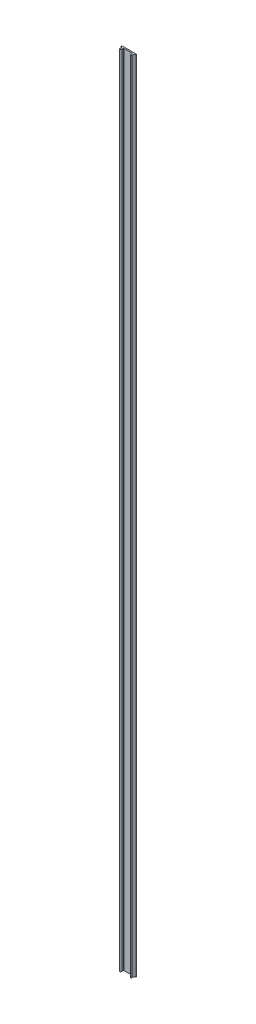
ISO-10303-21;
HEADER;
FILE_DESCRIPTION(('STEP AP214'),'2;1');
FILE_NAME('part.step','',(''),(''),'','','');
FILE_SCHEMA(('AUTOMOTIVE_DESIGN { 1 0 10303 214 1 1 1 1 }'));
ENDSEC;
DATA;
#1=APPLICATION_CONTEXT('core data for automotive mechanical design processes');
#2=APPLICATION_PROTOCOL_DEFINITION('international standard','automotive_design',2000,#1);
#3=PRODUCT_CONTEXT('',#1,'mechanical');
#4=PRODUCT('Part','Part','',(#3));
#5=PRODUCT_RELATED_PRODUCT_CATEGORY('part','',(#4));
#6=PRODUCT_DEFINITION_FORMATION('','',#4);
#7=PRODUCT_DEFINITION_CONTEXT('part definition',#1,'design');
#8=PRODUCT_DEFINITION('design','',#6,#7);
#9=PRODUCT_DEFINITION_SHAPE('','',#8);
#10=(LENGTH_UNIT() NAMED_UNIT(*) SI_UNIT(.MILLI.,.METRE.));
#11=(NAMED_UNIT(*) PLANE_ANGLE_UNIT() SI_UNIT($,.RADIAN.));
#12=(NAMED_UNIT(*) SI_UNIT($,.STERADIAN.) SOLID_ANGLE_UNIT());
#13=UNCERTAINTY_MEASURE_WITH_UNIT(LENGTH_MEASURE(1.E-05),#10,'distance_accuracy_value','');
#14=(GEOMETRIC_REPRESENTATION_CONTEXT(3) GLOBAL_UNCERTAINTY_ASSIGNED_CONTEXT((#13)) GLOBAL_UNIT_ASSIGNED_CONTEXT((#10,
#11,#12)) REPRESENTATION_CONTEXT('',''));
#15=CARTESIAN_POINT('',(0.,0.,0.));
#16=DIRECTION('',(0.,0.,1.));
#17=DIRECTION('',(1.,0.,0.));
#18=AXIS2_PLACEMENT_3D('',#15,#16,#17);
#19=CARTESIAN_POINT('',(4.23579334551751,500.,-0.3048));
#20=DIRECTION('',(0.,-1.,0.));
#21=DIRECTION('',(0.,0.,-1.));
#22=AXIS2_PLACEMENT_3D('',#19,#20,#21);
#23=CYLINDRICAL_SURFACE('',#22,0.457200000000001);
#24=CARTESIAN_POINT('',(4.23579334551751,0.,-0.3048));
#25=DIRECTION('',(0.,1.,0.));
#26=DIRECTION('',(0.,0.,1.));
#27=AXIS2_PLACEMENT_3D('',#24,#25,#26);
#28=CIRCLE('',#27,0.457200000000001);
#29=CARTESIAN_POINT('',(4.69299334551751,0.,-0.304799999999991));
#30=VERTEX_POINT('',#29);
#31=CARTESIAN_POINT('',(4.23579334551751,0.,-0.762));
#32=VERTEX_POINT('',#31);
#33=EDGE_CURVE('E123',#30,#32,#28,.T.);
#34=ORIENTED_EDGE('',*,*,#33,.T.);
#35=DIRECTION('',(0.,-1.,0.));
#36=VECTOR('',#35,1.);
#37=CARTESIAN_POINT('',(4.23579334551751,500.,-0.762));
#38=LINE('',#37,#36);
#39=CARTESIAN_POINT('',(4.23579334551751,500.,-0.762));
#40=VERTEX_POINT('',#39);
#41=EDGE_CURVE('E11',#40,#32,#38,.T.);
#42=ORIENTED_EDGE('',*,*,#41,.F.);
#43=CARTESIAN_POINT('',(4.23579334551751,500.,-0.3048));
#44=DIRECTION('',(0.,1.,0.));
#45=DIRECTION('',(0.,0.,1.));
#46=AXIS2_PLACEMENT_3D('',#43,#44,#45);
#47=CIRCLE('',#46,0.457200000000001);
#48=CARTESIAN_POINT('',(4.69299334551751,500.,-0.304799999999991));
#49=VERTEX_POINT('',#48);
#50=EDGE_CURVE('E137',#49,#40,#47,.T.);
#51=ORIENTED_EDGE('',*,*,#50,.F.);
#52=DIRECTION('',(0.,-1.,0.));
#53=VECTOR('',#52,1.);
#54=CARTESIAN_POINT('',(4.69299334551751,500.,-0.304799999999991));
#55=LINE('',#54,#53);
#56=EDGE_CURVE('E119',#49,#30,#55,.T.);
#57=ORIENTED_EDGE('',*,*,#56,.T.);
#58=EDGE_LOOP('',(#34,#42,#51,#57));
#59=FACE_BOUND('',#58,.T.);
#60=ADVANCED_FACE('F34',(#59),#23,.T.);
#61=CARTESIAN_POINT('',(0.,500.,-0.762));
#62=DIRECTION('',(0.,0.,1.));
#63=DIRECTION('',(1.,0.,0.));
#64=AXIS2_PLACEMENT_3D('',#61,#62,#63);
#65=PLANE('',#64);
#66=DIRECTION('',(-1.,0.,0.));
#67=VECTOR('',#66,1.);
#68=CARTESIAN_POINT('',(0.,0.,-0.762));
#69=LINE('',#68,#67);
#70=CARTESIAN_POINT('',(-4.23579334551751,0.,-0.762));
#71=VERTEX_POINT('',#70);
#72=EDGE_CURVE('E126',#32,#71,#69,.T.);
#73=ORIENTED_EDGE('',*,*,#72,.T.);
#74=DIRECTION('',(0.,-1.,0.));
#75=VECTOR('',#74,1.);
#76=CARTESIAN_POINT('',(-4.23579334551751,500.,-0.762));
#77=LINE('',#76,#75);
#78=CARTESIAN_POINT('',(-4.23579334551751,500.,-0.762));
#79=VERTEX_POINT('',#78);
#80=EDGE_CURVE('E298',#79,#71,#77,.T.);
#81=ORIENTED_EDGE('',*,*,#80,.F.);
#82=DIRECTION('',(-1.,0.,0.));
#83=VECTOR('',#82,1.);
#84=CARTESIAN_POINT('',(0.,500.,-0.762));
#85=LINE('',#84,#83);
#86=EDGE_CURVE('E88',#40,#79,#85,.T.);
#87=ORIENTED_EDGE('',*,*,#86,.F.);
#88=ORIENTED_EDGE('',*,*,#41,.T.);
#89=EDGE_LOOP('',(#73,#81,#87,#88));
#90=FACE_BOUND('',#89,.T.);
#91=ADVANCED_FACE('F169',(#90),#65,.F.);
#92=CARTESIAN_POINT('',(0.,500.,0.));
#93=DIRECTION('',(0.,0.,-1.));
#94=DIRECTION('',(-1.,0.,0.));
#95=AXIS2_PLACEMENT_3D('',#92,#93,#94);
#96=PLANE('',#95);
#97=DIRECTION('',(1.,0.,0.));
#98=VECTOR('',#97,1.);
#99=CARTESIAN_POINT('',(0.,0.,0.));
#100=LINE('',#99,#98);
#101=CARTESIAN_POINT('',(-2.43239334551752,0.,0.));
#102=VERTEX_POINT('',#101);
#103=CARTESIAN_POINT('',(2.43239334551752,0.,0.));
#104=VERTEX_POINT('',#103);
#105=EDGE_CURVE('E130',#102,#104,#100,.T.);
#106=ORIENTED_EDGE('',*,*,#105,.T.);
#107=DIRECTION('',(0.,-1.,0.));
#108=VECTOR('',#107,1.);
#109=CARTESIAN_POINT('',(2.43239334551752,500.,0.));
#110=LINE('',#109,#108);
#111=CARTESIAN_POINT('',(2.43239334551752,500.,0.));
#112=VERTEX_POINT('',#111);
#113=EDGE_CURVE('E42',#112,#104,#110,.T.);
#114=ORIENTED_EDGE('',*,*,#113,.F.);
#115=DIRECTION('',(1.,0.,0.));
#116=VECTOR('',#115,1.);
#117=CARTESIAN_POINT('',(0.,500.,0.));
#118=LINE('',#117,#116);
#119=CARTESIAN_POINT('',(-2.43239334551752,500.,0.));
#120=VERTEX_POINT('',#119);
#121=EDGE_CURVE('E314',#120,#112,#118,.T.);
#122=ORIENTED_EDGE('',*,*,#121,.F.);
#123=DIRECTION('',(0.,-1.,0.));
#124=VECTOR('',#123,1.);
#125=CARTESIAN_POINT('',(-2.43239334551752,500.,0.));
#126=LINE('',#125,#124);
#127=EDGE_CURVE('E281',#120,#102,#126,.T.);
#128=ORIENTED_EDGE('',*,*,#127,.T.);
#129=EDGE_LOOP('',(#106,#114,#122,#128));
#130=FACE_BOUND('',#129,.T.);
#131=ADVANCED_FACE('F173',(#130),#96,.F.);
#132=CARTESIAN_POINT('',(2.43239334551752,500.,0.457199999999991));
#133=DIRECTION('',(0.,-1.,0.));
#134=DIRECTION('',(0.,0.,-1.));
#135=AXIS2_PLACEMENT_3D('',#132,#133,#134);
#136=CYLINDRICAL_SURFACE('',#135,0.457199999999991);
#137=CARTESIAN_POINT('',(2.43239334551752,0.,0.457199999999991));
#138=DIRECTION('',(0.,-1.,0.));
#139=DIRECTION('',(0.,0.,1.));
#140=AXIS2_PLACEMENT_3D('',#137,#138,#139);
#141=CIRCLE('',#140,0.457199999999991);
#142=CARTESIAN_POINT('',(2.88959334551751,0.,0.457199999999991));
#143=VERTEX_POINT('',#142);
#144=EDGE_CURVE('E132',#104,#143,#141,.T.);
#145=ORIENTED_EDGE('',*,*,#144,.T.);
#146=DIRECTION('',(0.,-1.,0.));
#147=VECTOR('',#146,1.);
#148=CARTESIAN_POINT('',(2.88959334551751,500.,0.457199999999991));
#149=LINE('',#148,#147);
#150=CARTESIAN_POINT('',(2.88959334551751,500.,0.457199999999991));
#151=VERTEX_POINT('',#150);
#152=EDGE_CURVE('E114',#151,#143,#149,.T.);
#153=ORIENTED_EDGE('',*,*,#152,.F.);
#154=CARTESIAN_POINT('',(2.43239334551752,500.,0.457199999999991));
#155=DIRECTION('',(0.,-1.,0.));
#156=DIRECTION('',(0.,0.,1.));
#157=AXIS2_PLACEMENT_3D('',#154,#155,#156);
#158=CIRCLE('',#157,0.457199999999991);
#159=EDGE_CURVE('E105',#112,#151,#158,.T.);
#160=ORIENTED_EDGE('',*,*,#159,.F.);
#161=ORIENTED_EDGE('',*,*,#113,.T.);
#162=EDGE_LOOP('',(#145,#153,#160,#161));
#163=FACE_BOUND('',#162,.T.);
#164=ADVANCED_FACE('F144',(#163),#136,.F.);
#165=CARTESIAN_POINT('',(2.88959334551751,500.,0.457199999999991));
#166=DIRECTION('',(1.,0.,0.));
#167=DIRECTION('',(0.,0.,-1.));
#168=AXIS2_PLACEMENT_3D('',#165,#166,#167);
#169=PLANE('',#168);
#170=DIRECTION('',(0.,0.,1.));
#171=VECTOR('',#170,1.);
#172=CARTESIAN_POINT('',(2.88959334551751,0.,0.457199999999991));
#173=LINE('',#172,#171);
#174=CARTESIAN_POINT('',(2.88959334551751,0.,1.36125000000002));
#175=VERTEX_POINT('',#174);
#176=EDGE_CURVE('E113',#143,#175,#173,.T.);
#177=ORIENTED_EDGE('',*,*,#176,.T.);
#178=DIRECTION('',(0.,-1.,0.));
#179=VECTOR('',#178,1.);
#180=CARTESIAN_POINT('',(2.88959334551751,500.,1.36125000000002));
#181=LINE('',#180,#179);
#182=CARTESIAN_POINT('',(2.88959334551751,500.,1.36125000000002));
#183=VERTEX_POINT('',#182);
#184=EDGE_CURVE('E110',#183,#175,#181,.T.);
#185=ORIENTED_EDGE('',*,*,#184,.F.);
#186=DIRECTION('',(0.,0.,1.));
#187=VECTOR('',#186,1.);
#188=CARTESIAN_POINT('',(2.88959334551751,500.,0.457199999999991));
#189=LINE('',#188,#187);
#190=EDGE_CURVE('E99',#151,#183,#189,.T.);
#191=ORIENTED_EDGE('',*,*,#190,.F.);
#192=ORIENTED_EDGE('',*,*,#152,.T.);
#193=EDGE_LOOP('',(#177,#185,#191,#192));
#194=FACE_BOUND('',#193,.T.);
#195=ADVANCED_FACE('F111',(#194),#169,.F.);
#196=CARTESIAN_POINT('',(3.33409334551752,500.,1.36125000000002));
#197=DIRECTION('',(0.,-1.,0.));
#198=DIRECTION('',(0.,0.,-1.));
#199=AXIS2_PLACEMENT_3D('',#196,#197,#198);
#200=CYLINDRICAL_SURFACE('',#199,0.444500000000015);
#201=CARTESIAN_POINT('',(3.33409334551752,0.,1.36125000000002));
#202=DIRECTION('',(0.,1.,0.));
#203=DIRECTION('',(0.,0.,-1.));
#204=AXIS2_PLACEMENT_3D('',#201,#202,#203);
#205=CIRCLE('',#204,0.444500000000015);
#206=CARTESIAN_POINT('',(3.74892706556451,0.,1.20158399011692));
#207=VERTEX_POINT('',#206);
#208=EDGE_CURVE('E74',#175,#207,#205,.T.);
#209=ORIENTED_EDGE('',*,*,#208,.T.);
#210=DIRECTION('',(0.,-1.,0.));
#211=VECTOR('',#210,1.);
#212=CARTESIAN_POINT('',(3.74892706556451,500.,1.20158399011692));
#213=LINE('',#212,#211);
#214=CARTESIAN_POINT('',(3.74892706556451,500.,1.20158399011692));
#215=VERTEX_POINT('',#214);
#216=EDGE_CURVE('E115',#215,#207,#213,.T.);
#217=ORIENTED_EDGE('',*,*,#216,.F.);
#218=CARTESIAN_POINT('',(3.33409334551752,500.,1.36125000000002));
#219=DIRECTION('',(0.,1.,0.));
#220=DIRECTION('',(0.,0.,-1.));
#221=AXIS2_PLACEMENT_3D('',#218,#219,#220);
#222=CIRCLE('',#221,0.444500000000015);
#223=EDGE_CURVE('E103',#183,#215,#222,.T.);
#224=ORIENTED_EDGE('',*,*,#223,.F.);
#225=ORIENTED_EDGE('',*,*,#184,.T.);
#226=EDGE_LOOP('',(#209,#217,#224,#225));
#227=FACE_BOUND('',#226,.T.);
#228=ADVANCED_FACE('F117',(#227),#200,.T.);
#229=CARTESIAN_POINT('',(4.7859160902272,500.,0.802455636130385));
#230=DIRECTION('',(0.,-1.,0.));
#231=DIRECTION('',(0.,0.,-1.));
#232=AXIS2_PLACEMENT_3D('',#229,#230,#231);
#233=CYLINDRICAL_SURFACE('',#232,1.11114791104824);
#234=CARTESIAN_POINT('',(4.7859160902272,0.,0.802455636130385));
#235=DIRECTION('',(0.,-1.,0.));
#236=DIRECTION('',(0.,0.,1.));
#237=AXIS2_PLACEMENT_3D('',#234,#235,#236);
#238=CIRCLE('',#237,1.11114791104824);
#239=EDGE_CURVE('E80',#207,#30,#238,.T.);
#240=ORIENTED_EDGE('',*,*,#239,.T.);
#241=ORIENTED_EDGE('',*,*,#56,.F.);
#242=CARTESIAN_POINT('',(4.7859160902272,500.,0.802455636130385));
#243=DIRECTION('',(0.,-1.,0.));
#244=DIRECTION('',(0.,0.,1.));
#245=AXIS2_PLACEMENT_3D('',#242,#243,#244);
#246=CIRCLE('',#245,1.11114791104824);
#247=EDGE_CURVE('E50',#215,#49,#246,.T.);
#248=ORIENTED_EDGE('',*,*,#247,.F.);
#249=ORIENTED_EDGE('',*,*,#216,.T.);
#250=EDGE_LOOP('',(#240,#241,#248,#249));
#251=FACE_BOUND('',#250,.T.);
#252=ADVANCED_FACE('F158',(#251),#233,.F.);
#253=CARTESIAN_POINT('',(4.23579334551751,500.,-0.3048));
#254=DIRECTION('',(0.,1.,0.));
#255=DIRECTION('',(0.,0.,1.));
#256=AXIS2_PLACEMENT_3D('',#253,#254,#255);
#257=PLANE('',#256);
#258=ORIENTED_EDGE('',*,*,#50,.T.);
#259=ORIENTED_EDGE('',*,*,#86,.T.);
#260=CARTESIAN_POINT('',(-4.23579334551751,500.,-0.3048));
#261=DIRECTION('',(0.,-1.,0.));
#262=DIRECTION('',(0.,0.,1.));
#263=AXIS2_PLACEMENT_3D('',#260,#261,#262);
#264=CIRCLE('',#263,0.457200000000001);
#265=CARTESIAN_POINT('',(-4.69299334551751,500.,-0.304799999999991));
#266=VERTEX_POINT('',#265);
#267=EDGE_CURVE('E288',#266,#79,#264,.T.);
#268=ORIENTED_EDGE('',*,*,#267,.F.);
#269=CARTESIAN_POINT('',(-4.7859160902272,500.,0.802455636130385));
#270=DIRECTION('',(0.,1.,0.));
#271=DIRECTION('',(0.,0.,1.));
#272=AXIS2_PLACEMENT_3D('',#269,#270,#271);
#273=CIRCLE('',#272,1.11114791104824);
#274=CARTESIAN_POINT('',(-3.74892706556451,500.,1.20158399011692));
#275=VERTEX_POINT('',#274);
#276=EDGE_CURVE('E292',#275,#266,#273,.T.);
#277=ORIENTED_EDGE('',*,*,#276,.F.);
#278=CARTESIAN_POINT('',(-3.33409334551752,500.,1.36125000000002));
#279=DIRECTION('',(0.,-1.,0.));
#280=DIRECTION('',(0.,0.,-1.));
#281=AXIS2_PLACEMENT_3D('',#278,#279,#280);
#282=CIRCLE('',#281,0.444500000000015);
#283=CARTESIAN_POINT('',(-2.88959334551751,500.,1.36125000000002));
#284=VERTEX_POINT('',#283);
#285=EDGE_CURVE('E346',#284,#275,#282,.T.);
#286=ORIENTED_EDGE('',*,*,#285,.F.);
#287=DIRECTION('',(0.,0.,1.));
#288=VECTOR('',#287,1.);
#289=CARTESIAN_POINT('',(-2.88959334551751,500.,0.457199999999991));
#290=LINE('',#289,#288);
#291=CARTESIAN_POINT('',(-2.88959334551751,500.,0.457199999999991));
#292=VERTEX_POINT('',#291);
#293=EDGE_CURVE('E332',#292,#284,#290,.T.);
#294=ORIENTED_EDGE('',*,*,#293,.F.);
#295=CARTESIAN_POINT('',(-2.43239334551752,500.,0.457199999999991));
#296=DIRECTION('',(0.,1.,0.));
#297=DIRECTION('',(0.,0.,1.));
#298=AXIS2_PLACEMENT_3D('',#295,#296,#297);
#299=CIRCLE('',#298,0.457199999999991);
#300=EDGE_CURVE('E301',#120,#292,#299,.T.);
#301=ORIENTED_EDGE('',*,*,#300,.F.);
#302=ORIENTED_EDGE('',*,*,#121,.T.);
#303=ORIENTED_EDGE('',*,*,#159,.T.);
#304=ORIENTED_EDGE('',*,*,#190,.T.);
#305=ORIENTED_EDGE('',*,*,#223,.T.);
#306=ORIENTED_EDGE('',*,*,#247,.T.);
#307=EDGE_LOOP('',(#258,#259,#268,#277,#286,#294,#301,#302,#303,#304,#305,#306));
#308=FACE_BOUND('',#307,.T.);
#309=ADVANCED_FACE('F101',(#308),#257,.T.);
#310=CARTESIAN_POINT('',(4.23579334551751,0.,-0.3048));
#311=DIRECTION('',(0.,1.,0.));
#312=DIRECTION('',(0.,0.,1.));
#313=AXIS2_PLACEMENT_3D('',#310,#311,#312);
#314=PLANE('',#313);
#315=ORIENTED_EDGE('',*,*,#33,.F.);
#316=ORIENTED_EDGE('',*,*,#239,.F.);
#317=ORIENTED_EDGE('',*,*,#208,.F.);
#318=ORIENTED_EDGE('',*,*,#176,.F.);
#319=ORIENTED_EDGE('',*,*,#144,.F.);
#320=ORIENTED_EDGE('',*,*,#105,.F.);
#321=CARTESIAN_POINT('',(-2.43239334551752,0.,0.457199999999991));
#322=DIRECTION('',(0.,1.,0.));
#323=DIRECTION('',(0.,0.,1.));
#324=AXIS2_PLACEMENT_3D('',#321,#322,#323);
#325=CIRCLE('',#324,0.457199999999991);
#326=CARTESIAN_POINT('',(-2.88959334551751,0.,0.457199999999991));
#327=VERTEX_POINT('',#326);
#328=EDGE_CURVE('E278',#102,#327,#325,.T.);
#329=ORIENTED_EDGE('',*,*,#328,.T.);
#330=DIRECTION('',(0.,0.,1.));
#331=VECTOR('',#330,1.);
#332=CARTESIAN_POINT('',(-2.88959334551751,0.,0.457199999999991));
#333=LINE('',#332,#331);
#334=CARTESIAN_POINT('',(-2.88959334551751,0.,1.36125000000002));
#335=VERTEX_POINT('',#334);
#336=EDGE_CURVE('E289',#327,#335,#333,.T.);
#337=ORIENTED_EDGE('',*,*,#336,.T.);
#338=CARTESIAN_POINT('',(-3.33409334551752,0.,1.36125000000002));
#339=DIRECTION('',(0.,-1.,0.));
#340=DIRECTION('',(0.,0.,-1.));
#341=AXIS2_PLACEMENT_3D('',#338,#339,#340);
#342=CIRCLE('',#341,0.444500000000015);
#343=CARTESIAN_POINT('',(-3.74892706556451,0.,1.20158399011692));
#344=VERTEX_POINT('',#343);
#345=EDGE_CURVE('E294',#335,#344,#342,.T.);
#346=ORIENTED_EDGE('',*,*,#345,.T.);
#347=CARTESIAN_POINT('',(-4.7859160902272,0.,0.802455636130385));
#348=DIRECTION('',(0.,1.,0.));
#349=DIRECTION('',(0.,0.,1.));
#350=AXIS2_PLACEMENT_3D('',#347,#348,#349);
#351=CIRCLE('',#350,1.11114791104824);
#352=CARTESIAN_POINT('',(-4.69299334551751,0.,-0.304799999999991));
#353=VERTEX_POINT('',#352);
#354=EDGE_CURVE('E339',#344,#353,#351,.T.);
#355=ORIENTED_EDGE('',*,*,#354,.T.);
#356=CARTESIAN_POINT('',(-4.23579334551751,0.,-0.3048));
#357=DIRECTION('',(0.,-1.,0.));
#358=DIRECTION('',(0.,0.,1.));
#359=AXIS2_PLACEMENT_3D('',#356,#357,#358);
#360=CIRCLE('',#359,0.457200000000001);
#361=EDGE_CURVE('E340',#353,#71,#360,.T.);
#362=ORIENTED_EDGE('',*,*,#361,.T.);
#363=ORIENTED_EDGE('',*,*,#72,.F.);
#364=EDGE_LOOP('',(#315,#316,#317,#318,#319,#320,#329,#337,#346,#355,#362,#363));
#365=FACE_BOUND('',#364,.T.);
#366=ADVANCED_FACE('F150',(#365),#314,.F.);
#367=CARTESIAN_POINT('',(-4.23579334551751,500.,-0.3048));
#368=DIRECTION('',(0.,-1.,0.));
#369=DIRECTION('',(0.,0.,-1.));
#370=AXIS2_PLACEMENT_3D('',#367,#368,#369);
#371=CYLINDRICAL_SURFACE('',#370,0.457200000000001);
#372=ORIENTED_EDGE('',*,*,#361,.F.);
#373=DIRECTION('',(0.,-1.,0.));
#374=VECTOR('',#373,1.);
#375=CARTESIAN_POINT('',(-4.69299334551751,500.,-0.304799999999991));
#376=LINE('',#375,#374);
#377=EDGE_CURVE('E127',#266,#353,#376,.T.);
#378=ORIENTED_EDGE('',*,*,#377,.F.);
#379=ORIENTED_EDGE('',*,*,#267,.T.);
#380=ORIENTED_EDGE('',*,*,#80,.T.);
#381=EDGE_LOOP('',(#372,#378,#379,#380));
#382=FACE_BOUND('',#381,.T.);
#383=ADVANCED_FACE('F223',(#382),#371,.T.);
#384=CARTESIAN_POINT('',(-4.7859160902272,500.,0.802455636130385));
#385=DIRECTION('',(0.,-1.,0.));
#386=DIRECTION('',(0.,0.,-1.));
#387=AXIS2_PLACEMENT_3D('',#384,#385,#386);
#388=CYLINDRICAL_SURFACE('',#387,1.11114791104824);
#389=ORIENTED_EDGE('',*,*,#354,.F.);
#390=DIRECTION('',(0.,-1.,0.));
#391=VECTOR('',#390,1.);
#392=CARTESIAN_POINT('',(-3.74892706556451,500.,1.20158399011692));
#393=LINE('',#392,#391);
#394=EDGE_CURVE('E307',#275,#344,#393,.T.);
#395=ORIENTED_EDGE('',*,*,#394,.F.);
#396=ORIENTED_EDGE('',*,*,#276,.T.);
#397=ORIENTED_EDGE('',*,*,#377,.T.);
#398=EDGE_LOOP('',(#389,#395,#396,#397));
#399=FACE_BOUND('',#398,.T.);
#400=ADVANCED_FACE('F231',(#399),#388,.F.);
#401=CARTESIAN_POINT('',(-3.33409334551752,500.,1.36125000000002));
#402=DIRECTION('',(0.,-1.,0.));
#403=DIRECTION('',(0.,0.,-1.));
#404=AXIS2_PLACEMENT_3D('',#401,#402,#403);
#405=CYLINDRICAL_SURFACE('',#404,0.444500000000015);
#406=ORIENTED_EDGE('',*,*,#345,.F.);
#407=DIRECTION('',(0.,-1.,0.));
#408=VECTOR('',#407,1.);
#409=CARTESIAN_POINT('',(-2.88959334551751,500.,1.36125000000002));
#410=LINE('',#409,#408);
#411=EDGE_CURVE('E304',#284,#335,#410,.T.);
#412=ORIENTED_EDGE('',*,*,#411,.F.);
#413=ORIENTED_EDGE('',*,*,#285,.T.);
#414=ORIENTED_EDGE('',*,*,#394,.T.);
#415=EDGE_LOOP('',(#406,#412,#413,#414));
#416=FACE_BOUND('',#415,.T.);
#417=ADVANCED_FACE('F241',(#416),#405,.T.);
#418=CARTESIAN_POINT('',(-2.88959334551751,500.,0.457199999999991));
#419=DIRECTION('',(1.,0.,0.));
#420=DIRECTION('',(0.,0.,-1.));
#421=AXIS2_PLACEMENT_3D('',#418,#419,#420);
#422=PLANE('',#421);
#423=ORIENTED_EDGE('',*,*,#336,.F.);
#424=DIRECTION('',(0.,-1.,0.));
#425=VECTOR('',#424,1.);
#426=CARTESIAN_POINT('',(-2.88959334551751,500.,0.457199999999991));
#427=LINE('',#426,#425);
#428=EDGE_CURVE('E285',#292,#327,#427,.T.);
#429=ORIENTED_EDGE('',*,*,#428,.F.);
#430=ORIENTED_EDGE('',*,*,#293,.T.);
#431=ORIENTED_EDGE('',*,*,#411,.T.);
#432=EDGE_LOOP('',(#423,#429,#430,#431));
#433=FACE_BOUND('',#432,.T.);
#434=ADVANCED_FACE('F251',(#433),#422,.T.);
#435=CARTESIAN_POINT('',(-2.43239334551752,500.,0.457199999999991));
#436=DIRECTION('',(0.,-1.,0.));
#437=DIRECTION('',(0.,0.,-1.));
#438=AXIS2_PLACEMENT_3D('',#435,#436,#437);
#439=CYLINDRICAL_SURFACE('',#438,0.457199999999991);
#440=ORIENTED_EDGE('',*,*,#328,.F.);
#441=ORIENTED_EDGE('',*,*,#127,.F.);
#442=ORIENTED_EDGE('',*,*,#300,.T.);
#443=ORIENTED_EDGE('',*,*,#428,.T.);
#444=EDGE_LOOP('',(#440,#441,#442,#443));
#445=FACE_BOUND('',#444,.T.);
#446=ADVANCED_FACE('F261',(#445),#439,.F.);
#447=CLOSED_SHELL('',(#60,#91,#131,#164,#195,#228,#252,#309,#366,#383,#400,#417,#434,#446));
#448=MANIFOLD_SOLID_BREP('B2',#447);
#449=ADVANCED_BREP_SHAPE_REPRESENTATION('',(#18,#448),#14);
#450=SHAPE_DEFINITION_REPRESENTATION(#9,#449);
ENDSEC;
END-ISO-10303-21;
